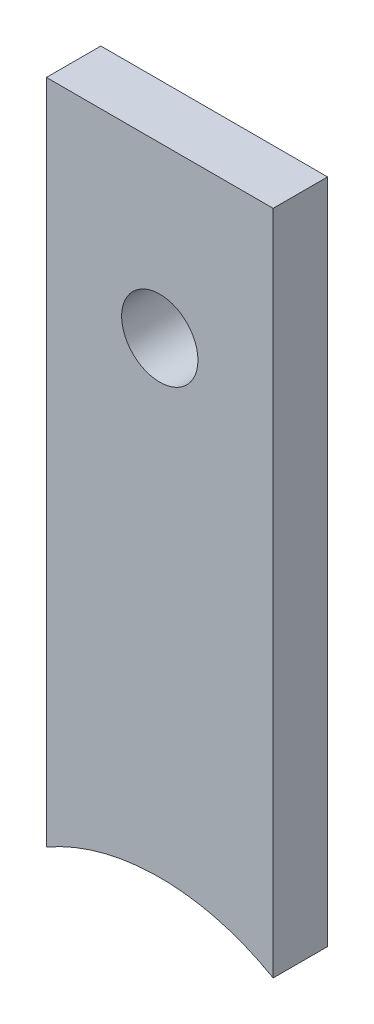
ISO-10303-21;
HEADER;
FILE_DESCRIPTION(('STEP AP214'),'2;1');
FILE_NAME('part.step','',(''),(''),'','','');
FILE_SCHEMA(('AUTOMOTIVE_DESIGN { 1 0 10303 214 1 1 1 1 }'));
ENDSEC;
DATA;
#1=APPLICATION_CONTEXT('core data for automotive mechanical design processes');
#2=APPLICATION_PROTOCOL_DEFINITION('international standard','automotive_design',2000,#1);
#3=PRODUCT_CONTEXT('',#1,'mechanical');
#4=PRODUCT('Part','Part','',(#3));
#5=PRODUCT_RELATED_PRODUCT_CATEGORY('part','',(#4));
#6=PRODUCT_DEFINITION_FORMATION('','',#4);
#7=PRODUCT_DEFINITION_CONTEXT('part definition',#1,'design');
#8=PRODUCT_DEFINITION('design','',#6,#7);
#9=PRODUCT_DEFINITION_SHAPE('','',#8);
#10=(LENGTH_UNIT() NAMED_UNIT(*) SI_UNIT(.MILLI.,.METRE.));
#11=(NAMED_UNIT(*) PLANE_ANGLE_UNIT() SI_UNIT($,.RADIAN.));
#12=(NAMED_UNIT(*) SI_UNIT($,.STERADIAN.) SOLID_ANGLE_UNIT());
#13=UNCERTAINTY_MEASURE_WITH_UNIT(LENGTH_MEASURE(1.E-05),#10,'distance_accuracy_value','');
#14=(GEOMETRIC_REPRESENTATION_CONTEXT(3) GLOBAL_UNCERTAINTY_ASSIGNED_CONTEXT((#13)) GLOBAL_UNIT_ASSIGNED_CONTEXT((#10,
#11,#12)) REPRESENTATION_CONTEXT('',''));
#15=CARTESIAN_POINT('',(0.,0.,0.));
#16=DIRECTION('',(0.,0.,1.));
#17=DIRECTION('',(1.,0.,0.));
#18=AXIS2_PLACEMENT_3D('',#15,#16,#17);
#19=CARTESIAN_POINT('',(0.,-116.801270189222,12.));
#20=DIRECTION('',(0.,0.,1.));
#21=DIRECTION('',(1.,0.,0.));
#22=AXIS2_PLACEMENT_3D('',#19,#20,#21);
#23=PLANE('',#22);
#24=DIRECTION('',(0.,1.,0.));
#25=VECTOR('',#24,1.);
#26=CARTESIAN_POINT('',(25.,-73.5,12.));
#27=LINE('',#26,#25);
#28=CARTESIAN_POINT('',(25.,-73.5,12.));
#29=VERTEX_POINT('',#28);
#30=CARTESIAN_POINT('',(25.,73.5,12.));
#31=VERTEX_POINT('',#30);
#32=EDGE_CURVE('E85',#29,#31,#27,.T.);
#33=ORIENTED_EDGE('',*,*,#32,.T.);
#34=DIRECTION('',(-1.,0.,0.));
#35=VECTOR('',#34,1.);
#36=CARTESIAN_POINT('',(-25.,73.5,12.));
#37=LINE('',#36,#35);
#38=CARTESIAN_POINT('',(-25.,73.5,12.));
#39=VERTEX_POINT('',#38);
#40=EDGE_CURVE('E80',#31,#39,#37,.T.);
#41=ORIENTED_EDGE('',*,*,#40,.T.);
#42=DIRECTION('',(0.,-1.,0.));
#43=VECTOR('',#42,1.);
#44=CARTESIAN_POINT('',(-25.,-73.5,12.));
#45=LINE('',#44,#43);
#46=CARTESIAN_POINT('',(-25.,-73.5,12.));
#47=VERTEX_POINT('',#46);
#48=EDGE_CURVE('E83',#39,#47,#45,.T.);
#49=ORIENTED_EDGE('',*,*,#48,.T.);
#50=CARTESIAN_POINT('',(0.,-116.801270189222,12.));
#51=DIRECTION('',(0.,0.,-1.));
#52=DIRECTION('',(1.,0.,0.));
#53=AXIS2_PLACEMENT_3D('',#50,#51,#52);
#54=CIRCLE('',#53,50.);
#55=EDGE_CURVE('E50',#47,#29,#54,.T.);
#56=ORIENTED_EDGE('',*,*,#55,.T.);
#57=EDGE_LOOP('',(#33,#41,#49,#56));
#58=FACE_BOUND('',#57,.T.);
#59=CARTESIAN_POINT('',(0.,36.1987298107781,12.));
#60=DIRECTION('',(0.,0.,1.));
#61=DIRECTION('',(1.,0.,0.));
#62=AXIS2_PLACEMENT_3D('',#59,#60,#61);
#63=CIRCLE('',#62,8.41295297608265);
#64=CARTESIAN_POINT('',(8.41295297608265,36.1987298107781,12.));
#65=VERTEX_POINT('',#64);
#66=EDGE_CURVE('E100',#65,#65,#63,.T.);
#67=ORIENTED_EDGE('',*,*,#66,.F.);
#68=EDGE_LOOP('',(#67));
#69=FACE_BOUND('',#68,.T.);
#70=ADVANCED_FACE('F33',(#58,#69),#23,.T.);
#71=CARTESIAN_POINT('',(0.,-116.801270189222,0.));
#72=DIRECTION('',(0.,0.,1.));
#73=DIRECTION('',(1.,0.,0.));
#74=AXIS2_PLACEMENT_3D('',#71,#72,#73);
#75=PLANE('',#74);
#76=DIRECTION('',(0.,1.,0.));
#77=VECTOR('',#76,1.);
#78=CARTESIAN_POINT('',(25.,-73.5,0.));
#79=LINE('',#78,#77);
#80=CARTESIAN_POINT('',(25.,-73.5,0.));
#81=VERTEX_POINT('',#80);
#82=CARTESIAN_POINT('',(25.,73.5,0.));
#83=VERTEX_POINT('',#82);
#84=EDGE_CURVE('E97',#81,#83,#79,.T.);
#85=ORIENTED_EDGE('',*,*,#84,.F.);
#86=CARTESIAN_POINT('',(0.,-116.801270189222,0.));
#87=DIRECTION('',(0.,0.,-1.));
#88=DIRECTION('',(1.,0.,0.));
#89=AXIS2_PLACEMENT_3D('',#86,#87,#88);
#90=CIRCLE('',#89,50.);
#91=CARTESIAN_POINT('',(-25.,-73.5,0.));
#92=VERTEX_POINT('',#91);
#93=EDGE_CURVE('E73',#92,#81,#90,.T.);
#94=ORIENTED_EDGE('',*,*,#93,.F.);
#95=DIRECTION('',(0.,-1.,0.));
#96=VECTOR('',#95,1.);
#97=CARTESIAN_POINT('',(-25.,-73.5,0.));
#98=LINE('',#97,#96);
#99=CARTESIAN_POINT('',(-25.,73.5,0.));
#100=VERTEX_POINT('',#99);
#101=EDGE_CURVE('E67',#100,#92,#98,.T.);
#102=ORIENTED_EDGE('',*,*,#101,.F.);
#103=DIRECTION('',(-1.,0.,0.));
#104=VECTOR('',#103,1.);
#105=CARTESIAN_POINT('',(-25.,73.5,0.));
#106=LINE('',#105,#104);
#107=EDGE_CURVE('E89',#83,#100,#106,.T.);
#108=ORIENTED_EDGE('',*,*,#107,.F.);
#109=EDGE_LOOP('',(#85,#94,#102,#108));
#110=FACE_BOUND('',#109,.T.);
#111=CARTESIAN_POINT('',(0.,36.1987298107781,0.));
#112=DIRECTION('',(0.,0.,1.));
#113=DIRECTION('',(1.,0.,0.));
#114=AXIS2_PLACEMENT_3D('',#111,#112,#113);
#115=CIRCLE('',#114,8.41295297608265);
#116=CARTESIAN_POINT('',(8.41295297608265,36.1987298107781,0.));
#117=VERTEX_POINT('',#116);
#118=EDGE_CURVE('E112',#117,#117,#115,.T.);
#119=ORIENTED_EDGE('',*,*,#118,.T.);
#120=EDGE_LOOP('',(#119));
#121=FACE_BOUND('',#120,.T.);
#122=ADVANCED_FACE('F108',(#110,#121),#75,.F.);
#123=CARTESIAN_POINT('',(25.,-73.5,12.));
#124=DIRECTION('',(-1.,0.,0.));
#125=DIRECTION('',(0.,0.,1.));
#126=AXIS2_PLACEMENT_3D('',#123,#124,#125);
#127=PLANE('',#126);
#128=ORIENTED_EDGE('',*,*,#84,.T.);
#129=DIRECTION('',(0.,0.,-1.));
#130=VECTOR('',#129,1.);
#131=CARTESIAN_POINT('',(25.,73.5,12.));
#132=LINE('',#131,#130);
#133=EDGE_CURVE('E11',#31,#83,#132,.T.);
#134=ORIENTED_EDGE('',*,*,#133,.F.);
#135=ORIENTED_EDGE('',*,*,#32,.F.);
#136=DIRECTION('',(0.,0.,-1.));
#137=VECTOR('',#136,1.);
#138=CARTESIAN_POINT('',(25.,-73.5,12.));
#139=LINE('',#138,#137);
#140=EDGE_CURVE('E93',#29,#81,#139,.T.);
#141=ORIENTED_EDGE('',*,*,#140,.T.);
#142=EDGE_LOOP('',(#128,#134,#135,#141));
#143=FACE_BOUND('',#142,.T.);
#144=ADVANCED_FACE('F35',(#143),#127,.F.);
#145=CARTESIAN_POINT('',(-25.,73.5,12.));
#146=DIRECTION('',(0.,-1.,0.));
#147=DIRECTION('',(0.,0.,-1.));
#148=AXIS2_PLACEMENT_3D('',#145,#146,#147);
#149=PLANE('',#148);
#150=ORIENTED_EDGE('',*,*,#107,.T.);
#151=DIRECTION('',(0.,0.,-1.));
#152=VECTOR('',#151,1.);
#153=CARTESIAN_POINT('',(-25.,73.5,12.));
#154=LINE('',#153,#152);
#155=EDGE_CURVE('E42',#39,#100,#154,.T.);
#156=ORIENTED_EDGE('',*,*,#155,.F.);
#157=ORIENTED_EDGE('',*,*,#40,.F.);
#158=ORIENTED_EDGE('',*,*,#133,.T.);
#159=EDGE_LOOP('',(#150,#156,#157,#158));
#160=FACE_BOUND('',#159,.T.);
#161=ADVANCED_FACE('F88',(#160),#149,.F.);
#162=CARTESIAN_POINT('',(-25.,-73.5,12.));
#163=DIRECTION('',(1.,0.,0.));
#164=DIRECTION('',(0.,0.,-1.));
#165=AXIS2_PLACEMENT_3D('',#162,#163,#164);
#166=PLANE('',#165);
#167=ORIENTED_EDGE('',*,*,#101,.T.);
#168=DIRECTION('',(0.,0.,-1.));
#169=VECTOR('',#168,1.);
#170=CARTESIAN_POINT('',(-25.,-73.5,12.));
#171=LINE('',#170,#169);
#172=EDGE_CURVE('E90',#47,#92,#171,.T.);
#173=ORIENTED_EDGE('',*,*,#172,.F.);
#174=ORIENTED_EDGE('',*,*,#48,.F.);
#175=ORIENTED_EDGE('',*,*,#155,.T.);
#176=EDGE_LOOP('',(#167,#173,#174,#175));
#177=FACE_BOUND('',#176,.T.);
#178=ADVANCED_FACE('F91',(#177),#166,.F.);
#179=CARTESIAN_POINT('',(0.,-116.801270189222,12.));
#180=DIRECTION('',(0.,0.,-1.));
#181=DIRECTION('',(-1.,0.,0.));
#182=AXIS2_PLACEMENT_3D('',#179,#180,#181);
#183=CYLINDRICAL_SURFACE('',#182,50.);
#184=ORIENTED_EDGE('',*,*,#93,.T.);
#185=ORIENTED_EDGE('',*,*,#140,.F.);
#186=ORIENTED_EDGE('',*,*,#55,.F.);
#187=ORIENTED_EDGE('',*,*,#172,.T.);
#188=EDGE_LOOP('',(#184,#185,#186,#187));
#189=FACE_BOUND('',#188,.T.);
#190=ADVANCED_FACE('F105',(#189),#183,.F.);
#191=CARTESIAN_POINT('',(0.,36.1987298107781,12.));
#192=DIRECTION('',(0.,0.,-1.));
#193=DIRECTION('',(-1.,0.,0.));
#194=AXIS2_PLACEMENT_3D('',#191,#192,#193);
#195=CYLINDRICAL_SURFACE('',#194,8.41295297608265);
#196=ORIENTED_EDGE('',*,*,#66,.T.);
#197=EDGE_LOOP('',(#196));
#198=FACE_BOUND('',#197,.T.);
#199=ORIENTED_EDGE('',*,*,#118,.F.);
#200=EDGE_LOOP('',(#199));
#201=FACE_BOUND('',#200,.T.);
#202=ADVANCED_FACE('F118',(#198,#201),#195,.F.);
#203=CLOSED_SHELL('',(#70,#122,#144,#161,#178,#190,#202));
#204=MANIFOLD_SOLID_BREP('B2',#203);
#205=ADVANCED_BREP_SHAPE_REPRESENTATION('',(#18,#204),#14);
#206=SHAPE_DEFINITION_REPRESENTATION(#9,#205);
ENDSEC;
END-ISO-10303-21;
